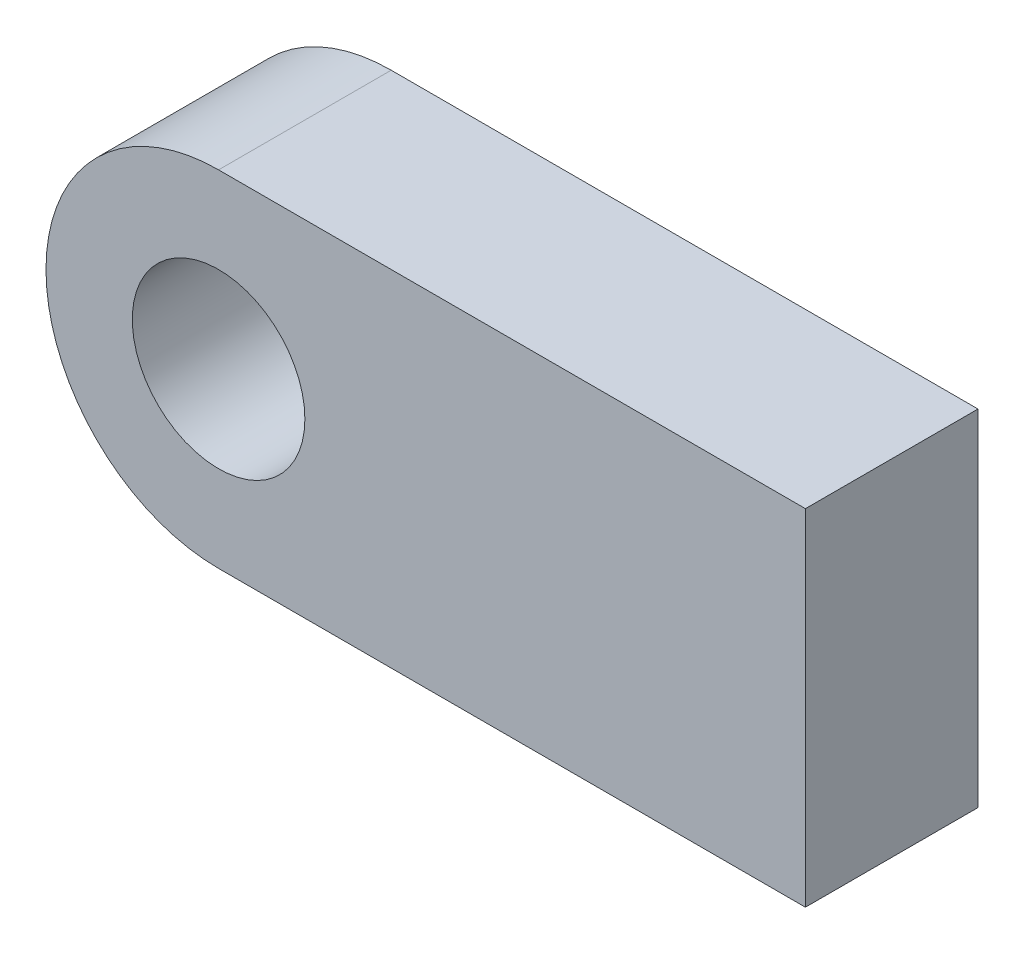
ISO-10303-21;
HEADER;
FILE_DESCRIPTION(('STEP AP214'),'2;1');
FILE_NAME('part.step','',(''),(''),'','','');
FILE_SCHEMA(('AUTOMOTIVE_DESIGN { 1 0 10303 214 1 1 1 1 }'));
ENDSEC;
DATA;
#1=APPLICATION_CONTEXT('core data for automotive mechanical design processes');
#2=APPLICATION_PROTOCOL_DEFINITION('international standard','automotive_design',2000,#1);
#3=PRODUCT_CONTEXT('',#1,'mechanical');
#4=PRODUCT('Part','Part','',(#3));
#5=PRODUCT_RELATED_PRODUCT_CATEGORY('part','',(#4));
#6=PRODUCT_DEFINITION_FORMATION('','',#4);
#7=PRODUCT_DEFINITION_CONTEXT('part definition',#1,'design');
#8=PRODUCT_DEFINITION('design','',#6,#7);
#9=PRODUCT_DEFINITION_SHAPE('','',#8);
#10=(LENGTH_UNIT() NAMED_UNIT(*) SI_UNIT(.MILLI.,.METRE.));
#11=(NAMED_UNIT(*) PLANE_ANGLE_UNIT() SI_UNIT($,.RADIAN.));
#12=(NAMED_UNIT(*) SI_UNIT($,.STERADIAN.) SOLID_ANGLE_UNIT());
#13=UNCERTAINTY_MEASURE_WITH_UNIT(LENGTH_MEASURE(1.E-05),#10,'distance_accuracy_value','');
#14=(GEOMETRIC_REPRESENTATION_CONTEXT(3) GLOBAL_UNCERTAINTY_ASSIGNED_CONTEXT((#13)) GLOBAL_UNIT_ASSIGNED_CONTEXT((#10,
#11,#12)) REPRESENTATION_CONTEXT('',''));
#15=CARTESIAN_POINT('',(0.,0.,0.));
#16=DIRECTION('',(0.,0.,1.));
#17=DIRECTION('',(1.,0.,0.));
#18=AXIS2_PLACEMENT_3D('',#15,#16,#17);
#19=CARTESIAN_POINT('',(-156.,-10.,1315.));
#20=DIRECTION('',(1.,0.,0.));
#21=DIRECTION('',(0.,0.,-1.));
#22=AXIS2_PLACEMENT_3D('',#19,#20,#21);
#23=PLANE('',#22);
#24=DIRECTION('',(0.,1.,0.));
#25=VECTOR('',#24,1.);
#26=CARTESIAN_POINT('',(-156.,-10.,1325.));
#27=LINE('',#26,#25);
#28=CARTESIAN_POINT('',(-156.,-10.,1325.));
#29=VERTEX_POINT('',#28);
#30=CARTESIAN_POINT('',(-156.,10.,1325.));
#31=VERTEX_POINT('',#30);
#32=EDGE_CURVE('E100',#29,#31,#27,.T.);
#33=ORIENTED_EDGE('',*,*,#32,.F.);
#34=DIRECTION('',(0.,0.,1.));
#35=VECTOR('',#34,1.);
#36=CARTESIAN_POINT('',(-156.,-10.,1315.));
#37=LINE('',#36,#35);
#38=CARTESIAN_POINT('',(-156.,-10.,1315.));
#39=VERTEX_POINT('',#38);
#40=EDGE_CURVE('E85',#39,#29,#37,.T.);
#41=ORIENTED_EDGE('',*,*,#40,.F.);
#42=DIRECTION('',(0.,1.,0.));
#43=VECTOR('',#42,1.);
#44=CARTESIAN_POINT('',(-156.,-10.,1315.));
#45=LINE('',#44,#43);
#46=CARTESIAN_POINT('',(-156.,10.,1315.));
#47=VERTEX_POINT('',#46);
#48=EDGE_CURVE('E110',#39,#47,#45,.T.);
#49=ORIENTED_EDGE('',*,*,#48,.T.);
#50=DIRECTION('',(0.,0.,1.));
#51=VECTOR('',#50,1.);
#52=CARTESIAN_POINT('',(-156.,10.,1315.));
#53=LINE('',#52,#51);
#54=EDGE_CURVE('E94',#47,#31,#53,.T.);
#55=ORIENTED_EDGE('',*,*,#54,.T.);
#56=EDGE_LOOP('',(#33,#41,#49,#55));
#57=FACE_BOUND('',#56,.T.);
#58=ADVANCED_FACE('F41',(#57),#23,.T.);
#59=CARTESIAN_POINT('',(-160.,-10.,1315.));
#60=DIRECTION('',(0.,-1.,0.));
#61=DIRECTION('',(0.,0.,-1.));
#62=AXIS2_PLACEMENT_3D('',#59,#60,#61);
#63=PLANE('',#62);
#64=DIRECTION('',(1.,0.,0.));
#65=VECTOR('',#64,1.);
#66=CARTESIAN_POINT('',(-160.,-10.,1325.));
#67=LINE('',#66,#65);
#68=CARTESIAN_POINT('',(-190.,-10.,1325.));
#69=VERTEX_POINT('',#68);
#70=EDGE_CURVE('E88',#69,#29,#67,.T.);
#71=ORIENTED_EDGE('',*,*,#70,.F.);
#72=DIRECTION('',(0.,0.,1.));
#73=VECTOR('',#72,1.);
#74=CARTESIAN_POINT('',(-190.,-10.,1315.));
#75=LINE('',#74,#73);
#76=CARTESIAN_POINT('',(-190.,-10.,1315.));
#77=VERTEX_POINT('',#76);
#78=EDGE_CURVE('E74',#77,#69,#75,.T.);
#79=ORIENTED_EDGE('',*,*,#78,.F.);
#80=DIRECTION('',(1.,0.,0.));
#81=VECTOR('',#80,1.);
#82=CARTESIAN_POINT('',(-190.,-10.,1315.));
#83=LINE('',#82,#81);
#84=EDGE_CURVE('E89',#77,#39,#83,.T.);
#85=ORIENTED_EDGE('',*,*,#84,.T.);
#86=ORIENTED_EDGE('',*,*,#40,.T.);
#87=EDGE_LOOP('',(#71,#79,#85,#86));
#88=FACE_BOUND('',#87,.T.);
#89=ADVANCED_FACE('F87',(#88),#63,.T.);
#90=CARTESIAN_POINT('',(-190.,0.,1315.));
#91=DIRECTION('',(0.,0.,1.));
#92=DIRECTION('',(1.,0.,0.));
#93=AXIS2_PLACEMENT_3D('',#90,#91,#92);
#94=CYLINDRICAL_SURFACE('',#93,10.0000000000001);
#95=CARTESIAN_POINT('',(-190.,0.,1325.));
#96=DIRECTION('',(0.,0.,1.));
#97=DIRECTION('',(1.,0.,0.));
#98=AXIS2_PLACEMENT_3D('',#95,#96,#97);
#99=CIRCLE('',#98,10.0000000000001);
#100=CARTESIAN_POINT('',(-190.,10.0000000000002,1325.));
#101=VERTEX_POINT('',#100);
#102=EDGE_CURVE('E101',#101,#69,#99,.T.);
#103=ORIENTED_EDGE('',*,*,#102,.F.);
#104=DIRECTION('',(0.,0.,1.));
#105=VECTOR('',#104,1.);
#106=CARTESIAN_POINT('',(-190.,10.0000000000002,1315.));
#107=LINE('',#106,#105);
#108=CARTESIAN_POINT('',(-190.,10.0000000000002,1315.));
#109=VERTEX_POINT('',#108);
#110=EDGE_CURVE('E58',#109,#101,#107,.T.);
#111=ORIENTED_EDGE('',*,*,#110,.F.);
#112=CARTESIAN_POINT('',(-190.,0.,1315.));
#113=DIRECTION('',(0.,0.,1.));
#114=DIRECTION('',(1.,0.,0.));
#115=AXIS2_PLACEMENT_3D('',#112,#113,#114);
#116=CIRCLE('',#115,10.0000000000001);
#117=EDGE_CURVE('E104',#109,#77,#116,.T.);
#118=ORIENTED_EDGE('',*,*,#117,.T.);
#119=ORIENTED_EDGE('',*,*,#78,.T.);
#120=EDGE_LOOP('',(#103,#111,#118,#119));
#121=FACE_BOUND('',#120,.T.);
#122=ADVANCED_FACE('F116',(#121),#94,.T.);
#123=CARTESIAN_POINT('',(-160.,10.,1315.));
#124=DIRECTION('',(0.,1.,0.));
#125=DIRECTION('',(-1.,0.,0.));
#126=AXIS2_PLACEMENT_3D('',#123,#124,#125);
#127=PLANE('',#126);
#128=DIRECTION('',(-1.,0.,0.));
#129=VECTOR('',#128,1.);
#130=CARTESIAN_POINT('',(-160.,10.,1325.));
#131=LINE('',#130,#129);
#132=EDGE_CURVE('E81',#31,#101,#131,.T.);
#133=ORIENTED_EDGE('',*,*,#132,.F.);
#134=ORIENTED_EDGE('',*,*,#54,.F.);
#135=DIRECTION('',(-1.,0.,0.));
#136=VECTOR('',#135,1.);
#137=CARTESIAN_POINT('',(-156.,10.,1315.));
#138=LINE('',#137,#136);
#139=EDGE_CURVE('E78',#47,#109,#138,.T.);
#140=ORIENTED_EDGE('',*,*,#139,.T.);
#141=ORIENTED_EDGE('',*,*,#110,.T.);
#142=EDGE_LOOP('',(#133,#134,#140,#141));
#143=FACE_BOUND('',#142,.T.);
#144=ADVANCED_FACE('F120',(#143),#127,.T.);
#145=CARTESIAN_POINT('',(-190.,0.,1315.));
#146=DIRECTION('',(0.,0.,1.));
#147=DIRECTION('',(1.,0.,0.));
#148=AXIS2_PLACEMENT_3D('',#145,#146,#147);
#149=PLANE('',#148);
#150=CARTESIAN_POINT('',(-190.,0.,1315.));
#151=DIRECTION('',(0.,0.,1.));
#152=DIRECTION('',(1.,0.,0.));
#153=AXIS2_PLACEMENT_3D('',#150,#151,#152);
#154=CIRCLE('',#153,4.99999999999999);
#155=CARTESIAN_POINT('',(-185.,0.,1315.));
#156=VERTEX_POINT('',#155);
#157=EDGE_CURVE('E45',#156,#156,#154,.T.);
#158=ORIENTED_EDGE('',*,*,#157,.T.);
#159=EDGE_LOOP('',(#158));
#160=FACE_BOUND('',#159,.T.);
#161=ORIENTED_EDGE('',*,*,#139,.F.);
#162=ORIENTED_EDGE('',*,*,#48,.F.);
#163=ORIENTED_EDGE('',*,*,#84,.F.);
#164=ORIENTED_EDGE('',*,*,#117,.F.);
#165=EDGE_LOOP('',(#161,#162,#163,#164));
#166=FACE_BOUND('',#165,.T.);
#167=ADVANCED_FACE('F118',(#160,#166),#149,.F.);
#168=CARTESIAN_POINT('',(-190.,0.,1325.));
#169=DIRECTION('',(0.,0.,1.));
#170=DIRECTION('',(1.,0.,0.));
#171=AXIS2_PLACEMENT_3D('',#168,#169,#170);
#172=PLANE('',#171);
#173=CARTESIAN_POINT('',(-190.,0.,1325.));
#174=DIRECTION('',(0.,0.,1.));
#175=DIRECTION('',(1.,0.,0.));
#176=AXIS2_PLACEMENT_3D('',#173,#174,#175);
#177=CIRCLE('',#176,4.99999999999999);
#178=CARTESIAN_POINT('',(-185.,0.,1325.));
#179=VERTEX_POINT('',#178);
#180=EDGE_CURVE('E11',#179,#179,#177,.T.);
#181=ORIENTED_EDGE('',*,*,#180,.F.);
#182=EDGE_LOOP('',(#181));
#183=FACE_BOUND('',#182,.T.);
#184=ORIENTED_EDGE('',*,*,#32,.T.);
#185=ORIENTED_EDGE('',*,*,#132,.T.);
#186=ORIENTED_EDGE('',*,*,#102,.T.);
#187=ORIENTED_EDGE('',*,*,#70,.T.);
#188=EDGE_LOOP('',(#184,#185,#186,#187));
#189=FACE_BOUND('',#188,.T.);
#190=ADVANCED_FACE('F99',(#183,#189),#172,.T.);
#191=CARTESIAN_POINT('',(-190.,0.,1315.));
#192=DIRECTION('',(0.,0.,1.));
#193=DIRECTION('',(1.,0.,0.));
#194=AXIS2_PLACEMENT_3D('',#191,#192,#193);
#195=CYLINDRICAL_SURFACE('',#194,4.99999999999999);
#196=ORIENTED_EDGE('',*,*,#157,.F.);
#197=EDGE_LOOP('',(#196));
#198=FACE_BOUND('',#197,.T.);
#199=ORIENTED_EDGE('',*,*,#180,.T.);
#200=EDGE_LOOP('',(#199));
#201=FACE_BOUND('',#200,.T.);
#202=ADVANCED_FACE('F43',(#198,#201),#195,.F.);
#203=CLOSED_SHELL('',(#58,#89,#122,#144,#167,#190,#202));
#204=MANIFOLD_SOLID_BREP('B2',#203);
#205=ADVANCED_BREP_SHAPE_REPRESENTATION('',(#18,#204),#14);
#206=SHAPE_DEFINITION_REPRESENTATION(#9,#205);
ENDSEC;
END-ISO-10303-21;
